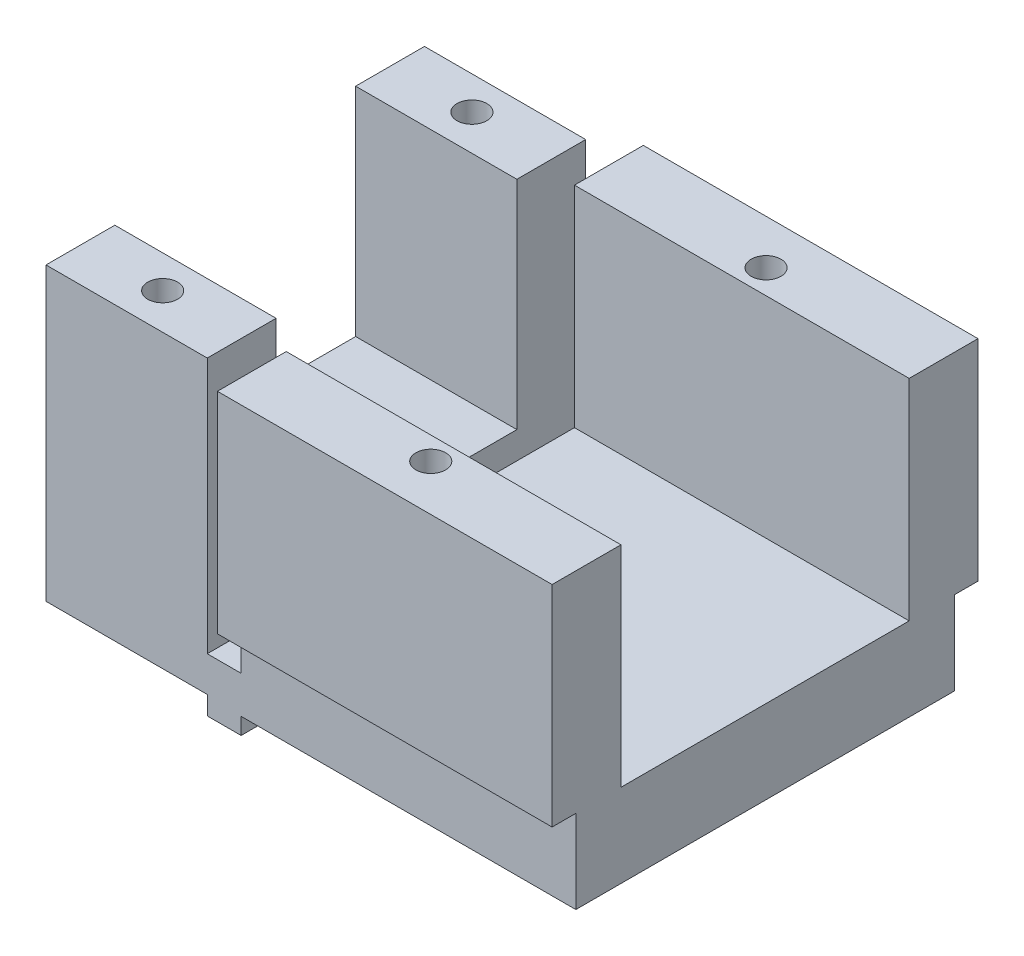
ISO-10303-21;
HEADER;
FILE_DESCRIPTION(('STEP AP214'),'2;1');
FILE_NAME('part.step','',(''),(''),'','','');
FILE_SCHEMA(('AUTOMOTIVE_DESIGN { 1 0 10303 214 1 1 1 1 }'));
ENDSEC;
DATA;
#1=APPLICATION_CONTEXT('core data for automotive mechanical design processes');
#2=APPLICATION_PROTOCOL_DEFINITION('international standard','automotive_design',2000,#1);
#3=PRODUCT_CONTEXT('',#1,'mechanical');
#4=PRODUCT('Part','Part','',(#3));
#5=PRODUCT_RELATED_PRODUCT_CATEGORY('part','',(#4));
#6=PRODUCT_DEFINITION_FORMATION('','',#4);
#7=PRODUCT_DEFINITION_CONTEXT('part definition',#1,'design');
#8=PRODUCT_DEFINITION('design','',#6,#7);
#9=PRODUCT_DEFINITION_SHAPE('','',#8);
#10=(LENGTH_UNIT() NAMED_UNIT(*) SI_UNIT(.MILLI.,.METRE.));
#11=(NAMED_UNIT(*) PLANE_ANGLE_UNIT() SI_UNIT($,.RADIAN.));
#12=(NAMED_UNIT(*) SI_UNIT($,.STERADIAN.) SOLID_ANGLE_UNIT());
#13=UNCERTAINTY_MEASURE_WITH_UNIT(LENGTH_MEASURE(1.E-05),#10,'distance_accuracy_value','');
#14=(GEOMETRIC_REPRESENTATION_CONTEXT(3) GLOBAL_UNCERTAINTY_ASSIGNED_CONTEXT((#13)) GLOBAL_UNIT_ASSIGNED_CONTEXT((#10,
#11,#12)) REPRESENTATION_CONTEXT('',''));
#15=CARTESIAN_POINT('',(0.,0.,0.));
#16=DIRECTION('',(0.,0.,1.));
#17=DIRECTION('',(1.,0.,0.));
#18=AXIS2_PLACEMENT_3D('',#15,#16,#17);
#19=CARTESIAN_POINT('',(11.9,1.27,0.));
#20=DIRECTION('',(-1.,0.,0.));
#21=DIRECTION('',(0.,0.,1.));
#22=AXIS2_PLACEMENT_3D('',#19,#20,#21);
#23=PLANE('',#22);
#24=DIRECTION('',(0.,0.,1.));
#25=VECTOR('',#24,1.);
#26=CARTESIAN_POINT('',(11.9,-1.63,0.));
#27=LINE('',#26,#25);
#28=CARTESIAN_POINT('',(11.9,-1.63,-22.215));
#29=VERTEX_POINT('',#28);
#30=CARTESIAN_POINT('',(11.9,-1.63,5.715));
#31=VERTEX_POINT('',#30);
#32=EDGE_CURVE('E385',#29,#31,#27,.T.);
#33=ORIENTED_EDGE('',*,*,#32,.F.);
#34=DIRECTION('',(0.,-1.,0.));
#35=VECTOR('',#34,1.);
#36=CARTESIAN_POINT('',(11.9,1.27,-22.215));
#37=LINE('',#36,#35);
#38=CARTESIAN_POINT('',(11.9,17.27,-22.215));
#39=VERTEX_POINT('',#38);
#40=EDGE_CURVE('E480',#39,#29,#37,.T.);
#41=ORIENTED_EDGE('',*,*,#40,.F.);
#42=DIRECTION('',(0.,0.,-1.));
#43=VECTOR('',#42,1.);
#44=CARTESIAN_POINT('',(11.9,17.27,-17.135));
#45=LINE('',#44,#43);
#46=CARTESIAN_POINT('',(11.9,17.27,-17.135));
#47=VERTEX_POINT('',#46);
#48=EDGE_CURVE('E377',#47,#39,#45,.T.);
#49=ORIENTED_EDGE('',*,*,#48,.F.);
#50=DIRECTION('',(0.,-1.,0.));
#51=VECTOR('',#50,1.);
#52=CARTESIAN_POINT('',(11.9,16.77,-17.135));
#53=LINE('',#52,#51);
#54=CARTESIAN_POINT('',(11.9,1.27,-17.135));
#55=VERTEX_POINT('',#54);
#56=EDGE_CURVE('E450',#47,#55,#53,.T.);
#57=ORIENTED_EDGE('',*,*,#56,.T.);
#58=DIRECTION('',(0.,0.,-1.));
#59=VECTOR('',#58,1.);
#60=CARTESIAN_POINT('',(11.9,1.27,0.));
#61=LINE('',#60,#59);
#62=CARTESIAN_POINT('',(11.9,1.27,0.635));
#63=VERTEX_POINT('',#62);
#64=EDGE_CURVE('E477',#63,#55,#61,.T.);
#65=ORIENTED_EDGE('',*,*,#64,.F.);
#66=DIRECTION('',(0.,-1.,0.));
#67=VECTOR('',#66,1.);
#68=CARTESIAN_POINT('',(11.9,16.77,0.635));
#69=LINE('',#68,#67);
#70=CARTESIAN_POINT('',(11.9,17.27,0.635));
#71=VERTEX_POINT('',#70);
#72=EDGE_CURVE('E461',#71,#63,#69,.T.);
#73=ORIENTED_EDGE('',*,*,#72,.F.);
#74=DIRECTION('',(0.,0.,-1.));
#75=VECTOR('',#74,1.);
#76=CARTESIAN_POINT('',(11.9,17.27,5.715));
#77=LINE('',#76,#75);
#78=CARTESIAN_POINT('',(11.9,17.27,5.715));
#79=VERTEX_POINT('',#78);
#80=EDGE_CURVE('E349',#79,#71,#77,.T.);
#81=ORIENTED_EDGE('',*,*,#80,.F.);
#82=DIRECTION('',(0.,-1.,0.));
#83=VECTOR('',#82,1.);
#84=CARTESIAN_POINT('',(11.9,1.27,5.715));
#85=LINE('',#84,#83);
#86=EDGE_CURVE('E484',#79,#31,#85,.T.);
#87=ORIENTED_EDGE('',*,*,#86,.T.);
#88=EDGE_LOOP('',(#33,#41,#49,#57,#65,#73,#81,#87));
#89=FACE_BOUND('',#88,.T.);
#90=ADVANCED_FACE('F45',(#89),#23,.F.);
#91=CARTESIAN_POINT('',(0.,1.27,0.));
#92=DIRECTION('',(0.,1.,0.));
#93=DIRECTION('',(0.,0.,1.));
#94=AXIS2_PLACEMENT_3D('',#91,#92,#93);
#95=PLANE('',#94);
#96=ORIENTED_EDGE('',*,*,#64,.T.);
#97=DIRECTION('',(-1.,0.,0.));
#98=VECTOR('',#97,1.);
#99=CARTESIAN_POINT('',(0.,1.27,-17.135));
#100=LINE('',#99,#98);
#101=CARTESIAN_POINT('',(0.,1.27,-17.135));
#102=VERTEX_POINT('',#101);
#103=EDGE_CURVE('E458',#55,#102,#100,.T.);
#104=ORIENTED_EDGE('',*,*,#103,.T.);
#105=DIRECTION('',(0.,0.,-1.));
#106=VECTOR('',#105,1.);
#107=CARTESIAN_POINT('',(0.,1.27,0.));
#108=LINE('',#107,#106);
#109=CARTESIAN_POINT('',(0.,1.27,0.635));
#110=VERTEX_POINT('',#109);
#111=EDGE_CURVE('E473',#110,#102,#108,.T.);
#112=ORIENTED_EDGE('',*,*,#111,.F.);
#113=DIRECTION('',(-1.,0.,0.));
#114=VECTOR('',#113,1.);
#115=CARTESIAN_POINT('',(0.,1.27,0.635));
#116=LINE('',#115,#114);
#117=EDGE_CURVE('E469',#63,#110,#116,.T.);
#118=ORIENTED_EDGE('',*,*,#117,.F.);
#119=EDGE_LOOP('',(#96,#104,#112,#118));
#120=FACE_BOUND('',#119,.T.);
#121=ADVANCED_FACE('F546',(#120),#95,.T.);
#122=CARTESIAN_POINT('',(0.,1.27,-22.215));
#123=DIRECTION('',(0.,0.,-1.));
#124=DIRECTION('',(-1.,0.,0.));
#125=AXIS2_PLACEMENT_3D('',#122,#123,#124);
#126=PLANE('',#125);
#127=ORIENTED_EDGE('',*,*,#40,.T.);
#128=DIRECTION('',(-1.,0.,0.));
#129=VECTOR('',#128,1.);
#130=CARTESIAN_POINT('',(14.4,-1.63,-22.215));
#131=LINE('',#130,#129);
#132=CARTESIAN_POINT('',(14.4,-1.63,-22.215));
#133=VERTEX_POINT('',#132);
#134=EDGE_CURVE('E396',#133,#29,#131,.T.);
#135=ORIENTED_EDGE('',*,*,#134,.F.);
#136=DIRECTION('',(0.,1.,0.));
#137=VECTOR('',#136,1.);
#138=CARTESIAN_POINT('',(14.4,1.27,-22.215));
#139=LINE('',#138,#137);
#140=CARTESIAN_POINT('',(14.4,1.77,-22.215));
#141=VERTEX_POINT('',#140);
#142=EDGE_CURVE('E322',#133,#141,#139,.T.);
#143=ORIENTED_EDGE('',*,*,#142,.T.);
#144=DIRECTION('',(-1.,0.,0.));
#145=VECTOR('',#144,1.);
#146=CARTESIAN_POINT('',(14.4,1.77,-22.215));
#147=LINE('',#146,#145);
#148=CARTESIAN_POINT('',(39.1,1.77,-22.215));
#149=VERTEX_POINT('',#148);
#150=EDGE_CURVE('E313',#149,#141,#147,.T.);
#151=ORIENTED_EDGE('',*,*,#150,.F.);
#152=DIRECTION('',(0.,1.,0.));
#153=VECTOR('',#152,1.);
#154=CARTESIAN_POINT('',(39.1,-3.6175,-22.215));
#155=LINE('',#154,#153);
#156=CARTESIAN_POINT('',(39.1,-4.38,-22.215));
#157=VERTEX_POINT('',#156);
#158=EDGE_CURVE('E325',#157,#149,#155,.T.);
#159=ORIENTED_EDGE('',*,*,#158,.F.);
#160=DIRECTION('',(-1.,0.,0.));
#161=VECTOR('',#160,1.);
#162=CARTESIAN_POINT('',(39.1,-4.38,-22.215));
#163=LINE('',#162,#161);
#164=CARTESIAN_POINT('',(14.4,-4.38,-22.215));
#165=VERTEX_POINT('',#164);
#166=EDGE_CURVE('E328',#157,#165,#163,.T.);
#167=ORIENTED_EDGE('',*,*,#166,.T.);
#168=DIRECTION('',(0.,1.,0.));
#169=VECTOR('',#168,1.);
#170=CARTESIAN_POINT('',(14.4,0.,-22.215));
#171=LINE('',#170,#169);
#172=CARTESIAN_POINT('',(14.4,-5.605,-22.215));
#173=VERTEX_POINT('',#172);
#174=EDGE_CURVE('E404',#173,#165,#171,.T.);
#175=ORIENTED_EDGE('',*,*,#174,.F.);
#176=DIRECTION('',(-1.,0.,0.));
#177=VECTOR('',#176,1.);
#178=CARTESIAN_POINT('',(14.4,-5.605,-22.215));
#179=LINE('',#178,#177);
#180=CARTESIAN_POINT('',(11.9,-5.605,-22.215));
#181=VERTEX_POINT('',#180);
#182=EDGE_CURVE('E424',#173,#181,#179,.T.);
#183=ORIENTED_EDGE('',*,*,#182,.T.);
#184=DIRECTION('',(0.,1.,0.));
#185=VECTOR('',#184,1.);
#186=CARTESIAN_POINT('',(11.9,0.,-22.215));
#187=LINE('',#186,#185);
#188=CARTESIAN_POINT('',(11.9,-4.23,-22.215));
#189=VERTEX_POINT('',#188);
#190=EDGE_CURVE('E415',#181,#189,#187,.T.);
#191=ORIENTED_EDGE('',*,*,#190,.T.);
#192=DIRECTION('',(1.,0.,0.));
#193=VECTOR('',#192,1.);
#194=CARTESIAN_POINT('',(0.,-4.23,-22.215));
#195=LINE('',#194,#193);
#196=CARTESIAN_POINT('',(0.,-4.23,-22.215));
#197=VERTEX_POINT('',#196);
#198=EDGE_CURVE('E433',#197,#189,#195,.T.);
#199=ORIENTED_EDGE('',*,*,#198,.F.);
#200=DIRECTION('',(0.,-1.,0.));
#201=VECTOR('',#200,1.);
#202=CARTESIAN_POINT('',(0.,1.27,-22.215));
#203=LINE('',#202,#201);
#204=CARTESIAN_POINT('',(0.,17.27,-22.215));
#205=VERTEX_POINT('',#204);
#206=EDGE_CURVE('E11',#205,#197,#203,.T.);
#207=ORIENTED_EDGE('',*,*,#206,.F.);
#208=DIRECTION('',(-1.,0.,0.));
#209=VECTOR('',#208,1.);
#210=CARTESIAN_POINT('',(0.,17.27,-22.215));
#211=LINE('',#210,#209);
#212=EDGE_CURVE('E381',#39,#205,#211,.T.);
#213=ORIENTED_EDGE('',*,*,#212,.F.);
#214=EDGE_LOOP('',(#127,#135,#143,#151,#159,#167,#175,#183,#191,#199,#207,#213));
#215=FACE_BOUND('',#214,.T.);
#216=ADVANCED_FACE('F47',(#215),#126,.T.);
#217=CARTESIAN_POINT('',(0.,1.27,0.));
#218=DIRECTION('',(-1.,0.,0.));
#219=DIRECTION('',(0.,0.,1.));
#220=AXIS2_PLACEMENT_3D('',#217,#218,#219);
#221=PLANE('',#220);
#222=ORIENTED_EDGE('',*,*,#206,.T.);
#223=DIRECTION('',(0.,0.,1.));
#224=VECTOR('',#223,1.);
#225=CARTESIAN_POINT('',(0.,-4.23,0.));
#226=LINE('',#225,#224);
#227=CARTESIAN_POINT('',(0.,-4.23,5.715));
#228=VERTEX_POINT('',#227);
#229=EDGE_CURVE('E429',#197,#228,#226,.T.);
#230=ORIENTED_EDGE('',*,*,#229,.T.);
#231=DIRECTION('',(0.,-1.,0.));
#232=VECTOR('',#231,1.);
#233=CARTESIAN_POINT('',(0.,1.27,5.715));
#234=LINE('',#233,#232);
#235=CARTESIAN_POINT('',(0.,17.27,5.715));
#236=VERTEX_POINT('',#235);
#237=EDGE_CURVE('E54',#236,#228,#234,.T.);
#238=ORIENTED_EDGE('',*,*,#237,.F.);
#239=DIRECTION('',(0.,0.,1.));
#240=VECTOR('',#239,1.);
#241=CARTESIAN_POINT('',(0.,17.27,5.715));
#242=LINE('',#241,#240);
#243=CARTESIAN_POINT('',(0.,17.27,0.635));
#244=VERTEX_POINT('',#243);
#245=EDGE_CURVE('E357',#244,#236,#242,.T.);
#246=ORIENTED_EDGE('',*,*,#245,.F.);
#247=DIRECTION('',(0.,-1.,0.));
#248=VECTOR('',#247,1.);
#249=CARTESIAN_POINT('',(0.,16.77,0.635));
#250=LINE('',#249,#248);
#251=EDGE_CURVE('E465',#244,#110,#250,.T.);
#252=ORIENTED_EDGE('',*,*,#251,.T.);
#253=ORIENTED_EDGE('',*,*,#111,.T.);
#254=DIRECTION('',(0.,-1.,0.));
#255=VECTOR('',#254,1.);
#256=CARTESIAN_POINT('',(0.,16.77,-17.135));
#257=LINE('',#256,#255);
#258=CARTESIAN_POINT('',(0.,17.27,-17.135));
#259=VERTEX_POINT('',#258);
#260=EDGE_CURVE('E454',#259,#102,#257,.T.);
#261=ORIENTED_EDGE('',*,*,#260,.F.);
#262=DIRECTION('',(0.,0.,1.));
#263=VECTOR('',#262,1.);
#264=CARTESIAN_POINT('',(0.,17.27,-17.135));
#265=LINE('',#264,#263);
#266=EDGE_CURVE('E369',#205,#259,#265,.T.);
#267=ORIENTED_EDGE('',*,*,#266,.F.);
#268=EDGE_LOOP('',(#222,#230,#238,#246,#252,#253,#261,#267));
#269=FACE_BOUND('',#268,.T.);
#270=ADVANCED_FACE('F495',(#269),#221,.T.);
#271=CARTESIAN_POINT('',(0.,1.27,5.715));
#272=DIRECTION('',(0.,0.,-1.));
#273=DIRECTION('',(-1.,0.,0.));
#274=AXIS2_PLACEMENT_3D('',#271,#272,#273);
#275=PLANE('',#274);
#276=ORIENTED_EDGE('',*,*,#237,.T.);
#277=DIRECTION('',(1.,0.,0.));
#278=VECTOR('',#277,1.);
#279=CARTESIAN_POINT('',(0.,-4.23,5.715));
#280=LINE('',#279,#278);
#281=CARTESIAN_POINT('',(11.9,-4.23,5.715));
#282=VERTEX_POINT('',#281);
#283=EDGE_CURVE('E437',#228,#282,#280,.T.);
#284=ORIENTED_EDGE('',*,*,#283,.T.);
#285=DIRECTION('',(0.,-1.,0.));
#286=VECTOR('',#285,1.);
#287=CARTESIAN_POINT('',(11.9,0.,5.715));
#288=LINE('',#287,#286);
#289=CARTESIAN_POINT('',(11.9,-5.605,5.715));
#290=VERTEX_POINT('',#289);
#291=EDGE_CURVE('E405',#282,#290,#288,.T.);
#292=ORIENTED_EDGE('',*,*,#291,.T.);
#293=DIRECTION('',(-1.,0.,0.));
#294=VECTOR('',#293,1.);
#295=CARTESIAN_POINT('',(14.4,-5.605,5.715));
#296=LINE('',#295,#294);
#297=CARTESIAN_POINT('',(14.4,-5.605,5.715));
#298=VERTEX_POINT('',#297);
#299=EDGE_CURVE('E411',#298,#290,#296,.T.);
#300=ORIENTED_EDGE('',*,*,#299,.F.);
#301=DIRECTION('',(0.,-1.,0.));
#302=VECTOR('',#301,1.);
#303=CARTESIAN_POINT('',(14.4,0.,5.715));
#304=LINE('',#303,#302);
#305=CARTESIAN_POINT('',(14.4,-4.38,5.715));
#306=VERTEX_POINT('',#305);
#307=EDGE_CURVE('E408',#306,#298,#304,.T.);
#308=ORIENTED_EDGE('',*,*,#307,.F.);
#309=DIRECTION('',(-1.,0.,0.));
#310=VECTOR('',#309,1.);
#311=CARTESIAN_POINT('',(39.1,-4.38,5.715));
#312=LINE('',#311,#310);
#313=CARTESIAN_POINT('',(39.1,-4.38,5.715));
#314=VERTEX_POINT('',#313);
#315=EDGE_CURVE('E341',#314,#306,#312,.T.);
#316=ORIENTED_EDGE('',*,*,#315,.F.);
#317=DIRECTION('',(0.,-1.,0.));
#318=VECTOR('',#317,1.);
#319=CARTESIAN_POINT('',(39.1,-1.63,5.715));
#320=LINE('',#319,#318);
#321=CARTESIAN_POINT('',(39.1,1.77,5.715));
#322=VERTEX_POINT('',#321);
#323=EDGE_CURVE('E318',#322,#314,#320,.T.);
#324=ORIENTED_EDGE('',*,*,#323,.F.);
#325=DIRECTION('',(1.,0.,0.));
#326=VECTOR('',#325,1.);
#327=CARTESIAN_POINT('',(14.4,1.77,5.715));
#328=LINE('',#327,#326);
#329=CARTESIAN_POINT('',(14.4,1.77,5.715));
#330=VERTEX_POINT('',#329);
#331=EDGE_CURVE('E307',#330,#322,#328,.T.);
#332=ORIENTED_EDGE('',*,*,#331,.F.);
#333=DIRECTION('',(0.,-1.,0.));
#334=VECTOR('',#333,1.);
#335=CARTESIAN_POINT('',(14.4,-1.63,5.715));
#336=LINE('',#335,#334);
#337=CARTESIAN_POINT('',(14.4,-1.63,5.715));
#338=VERTEX_POINT('',#337);
#339=EDGE_CURVE('E317',#330,#338,#336,.T.);
#340=ORIENTED_EDGE('',*,*,#339,.T.);
#341=DIRECTION('',(-1.,0.,0.));
#342=VECTOR('',#341,1.);
#343=CARTESIAN_POINT('',(14.4,-1.63,5.715));
#344=LINE('',#343,#342);
#345=EDGE_CURVE('E390',#338,#31,#344,.T.);
#346=ORIENTED_EDGE('',*,*,#345,.T.);
#347=ORIENTED_EDGE('',*,*,#86,.F.);
#348=DIRECTION('',(1.,0.,0.));
#349=VECTOR('',#348,1.);
#350=CARTESIAN_POINT('',(0.,17.27,5.715));
#351=LINE('',#350,#349);
#352=EDGE_CURVE('E353',#236,#79,#351,.T.);
#353=ORIENTED_EDGE('',*,*,#352,.F.);
#354=EDGE_LOOP('',(#276,#284,#292,#300,#308,#316,#324,#332,#340,#346,#347,#353));
#355=FACE_BOUND('',#354,.T.);
#356=ADVANCED_FACE('F490',(#355),#275,.F.);
#357=CARTESIAN_POINT('',(0.,16.77,0.635));
#358=DIRECTION('',(0.,0.,-1.));
#359=DIRECTION('',(-1.,0.,0.));
#360=AXIS2_PLACEMENT_3D('',#357,#358,#359);
#361=PLANE('',#360);
#362=ORIENTED_EDGE('',*,*,#72,.T.);
#363=ORIENTED_EDGE('',*,*,#117,.T.);
#364=ORIENTED_EDGE('',*,*,#251,.F.);
#365=DIRECTION('',(-1.,0.,0.));
#366=VECTOR('',#365,1.);
#367=CARTESIAN_POINT('',(0.,17.27,0.635));
#368=LINE('',#367,#366);
#369=EDGE_CURVE('E345',#71,#244,#368,.T.);
#370=ORIENTED_EDGE('',*,*,#369,.F.);
#371=EDGE_LOOP('',(#362,#363,#364,#370));
#372=FACE_BOUND('',#371,.T.);
#373=ADVANCED_FACE('F558',(#372),#361,.T.);
#374=CARTESIAN_POINT('',(0.,16.77,-17.135));
#375=DIRECTION('',(0.,0.,-1.));
#376=DIRECTION('',(-1.,0.,0.));
#377=AXIS2_PLACEMENT_3D('',#374,#375,#376);
#378=PLANE('',#377);
#379=ORIENTED_EDGE('',*,*,#103,.F.);
#380=ORIENTED_EDGE('',*,*,#56,.F.);
#381=DIRECTION('',(1.,0.,0.));
#382=VECTOR('',#381,1.);
#383=CARTESIAN_POINT('',(0.,17.27,-17.135));
#384=LINE('',#383,#382);
#385=EDGE_CURVE('E373',#259,#47,#384,.T.);
#386=ORIENTED_EDGE('',*,*,#385,.F.);
#387=ORIENTED_EDGE('',*,*,#260,.T.);
#388=EDGE_LOOP('',(#379,#380,#386,#387));
#389=FACE_BOUND('',#388,.T.);
#390=ADVANCED_FACE('F575',(#389),#378,.F.);
#391=CARTESIAN_POINT('',(0.,-4.23,0.));
#392=DIRECTION('',(0.,1.,0.));
#393=DIRECTION('',(0.,0.,1.));
#394=AXIS2_PLACEMENT_3D('',#391,#392,#393);
#395=PLANE('',#394);
#396=DIRECTION('',(0.,0.,1.));
#397=VECTOR('',#396,1.);
#398=CARTESIAN_POINT('',(11.9,-4.23,0.));
#399=LINE('',#398,#397);
#400=EDGE_CURVE('E428',#189,#282,#399,.T.);
#401=ORIENTED_EDGE('',*,*,#400,.T.);
#402=ORIENTED_EDGE('',*,*,#283,.F.);
#403=ORIENTED_EDGE('',*,*,#229,.F.);
#404=ORIENTED_EDGE('',*,*,#198,.T.);
#405=EDGE_LOOP('',(#401,#402,#403,#404));
#406=FACE_BOUND('',#405,.T.);
#407=ADVANCED_FACE('F499',(#406),#395,.F.);
#408=CARTESIAN_POINT('',(14.4,-5.605,0.));
#409=DIRECTION('',(0.,1.,0.));
#410=DIRECTION('',(0.,0.,1.));
#411=AXIS2_PLACEMENT_3D('',#408,#409,#410);
#412=PLANE('',#411);
#413=DIRECTION('',(0.,0.,-1.));
#414=VECTOR('',#413,1.);
#415=CARTESIAN_POINT('',(11.9,-5.605,0.));
#416=LINE('',#415,#414);
#417=EDGE_CURVE('E399',#290,#181,#416,.T.);
#418=ORIENTED_EDGE('',*,*,#417,.T.);
#419=ORIENTED_EDGE('',*,*,#182,.F.);
#420=DIRECTION('',(0.,0.,-1.));
#421=VECTOR('',#420,1.);
#422=CARTESIAN_POINT('',(14.4,-5.605,0.));
#423=LINE('',#422,#421);
#424=EDGE_CURVE('E400',#298,#173,#423,.T.);
#425=ORIENTED_EDGE('',*,*,#424,.F.);
#426=ORIENTED_EDGE('',*,*,#299,.T.);
#427=EDGE_LOOP('',(#418,#419,#425,#426));
#428=FACE_BOUND('',#427,.T.);
#429=ADVANCED_FACE('F509',(#428),#412,.F.);
#430=CARTESIAN_POINT('',(14.4,0.,0.));
#431=DIRECTION('',(1.,0.,0.));
#432=DIRECTION('',(0.,0.,-1.));
#433=AXIS2_PLACEMENT_3D('',#430,#431,#432);
#434=PLANE('',#433);
#435=DIRECTION('',(0.,0.,-1.));
#436=VECTOR('',#435,1.);
#437=CARTESIAN_POINT('',(14.4,-4.38,-22.215));
#438=LINE('',#437,#436);
#439=EDGE_CURVE('E332',#306,#165,#438,.T.);
#440=ORIENTED_EDGE('',*,*,#439,.F.);
#441=ORIENTED_EDGE('',*,*,#307,.T.);
#442=ORIENTED_EDGE('',*,*,#424,.T.);
#443=ORIENTED_EDGE('',*,*,#174,.T.);
#444=EDGE_LOOP('',(#440,#441,#442,#443));
#445=FACE_BOUND('',#444,.T.);
#446=ADVANCED_FACE('F512',(#445),#434,.T.);
#447=CARTESIAN_POINT('',(11.9,0.,0.));
#448=DIRECTION('',(1.,0.,0.));
#449=DIRECTION('',(0.,0.,-1.));
#450=AXIS2_PLACEMENT_3D('',#447,#448,#449);
#451=PLANE('',#450);
#452=ORIENTED_EDGE('',*,*,#400,.F.);
#453=ORIENTED_EDGE('',*,*,#190,.F.);
#454=ORIENTED_EDGE('',*,*,#417,.F.);
#455=ORIENTED_EDGE('',*,*,#291,.F.);
#456=EDGE_LOOP('',(#452,#453,#454,#455));
#457=FACE_BOUND('',#456,.T.);
#458=ADVANCED_FACE('F504',(#457),#451,.F.);
#459=CARTESIAN_POINT('',(14.4,-1.63,0.));
#460=DIRECTION('',(0.,-1.,0.));
#461=DIRECTION('',(0.,0.,-1.));
#462=AXIS2_PLACEMENT_3D('',#459,#460,#461);
#463=PLANE('',#462);
#464=ORIENTED_EDGE('',*,*,#32,.T.);
#465=ORIENTED_EDGE('',*,*,#345,.F.);
#466=DIRECTION('',(0.,0.,1.));
#467=VECTOR('',#466,1.);
#468=CARTESIAN_POINT('',(14.4,-1.63,0.));
#469=LINE('',#468,#467);
#470=EDGE_CURVE('E386',#133,#338,#469,.T.);
#471=ORIENTED_EDGE('',*,*,#470,.F.);
#472=ORIENTED_EDGE('',*,*,#134,.T.);
#473=EDGE_LOOP('',(#464,#465,#471,#472));
#474=FACE_BOUND('',#473,.T.);
#475=ADVANCED_FACE('F584',(#474),#463,.F.);
#476=CARTESIAN_POINT('',(0.,17.27,0.));
#477=DIRECTION('',(0.,-1.,0.));
#478=DIRECTION('',(0.,0.,-1.));
#479=AXIS2_PLACEMENT_3D('',#476,#477,#478);
#480=PLANE('',#479);
#481=ORIENTED_EDGE('',*,*,#266,.T.);
#482=ORIENTED_EDGE('',*,*,#385,.T.);
#483=ORIENTED_EDGE('',*,*,#48,.T.);
#484=ORIENTED_EDGE('',*,*,#212,.T.);
#485=EDGE_LOOP('',(#481,#482,#483,#484));
#486=FACE_BOUND('',#485,.T.);
#487=CARTESIAN_POINT('',(5.95,17.27,-19.765430594767));
#488=DIRECTION('',(0.,1.,0.));
#489=DIRECTION('',(0.,0.,1.));
#490=AXIS2_PLACEMENT_3D('',#487,#488,#489);
#491=CIRCLE('',#490,1.1);
#492=CARTESIAN_POINT('',(5.95,17.27,-18.665430594767));
#493=VERTEX_POINT('',#492);
#494=EDGE_CURVE('E365',#493,#493,#491,.T.);
#495=ORIENTED_EDGE('',*,*,#494,.F.);
#496=EDGE_LOOP('',(#495));
#497=FACE_BOUND('',#496,.T.);
#498=ADVANCED_FACE('F570',(#486,#497),#480,.F.);
#499=CARTESIAN_POINT('',(5.95,6.61,-19.765430594767));
#500=DIRECTION('',(0.,1.,0.));
#501=DIRECTION('',(0.,0.,1.));
#502=AXIS2_PLACEMENT_3D('',#499,#500,#501);
#503=PLANE('',#502);
#504=CARTESIAN_POINT('',(5.95,6.61,-19.765430594767));
#505=DIRECTION('',(0.,1.,0.));
#506=DIRECTION('',(0.,0.,1.));
#507=AXIS2_PLACEMENT_3D('',#504,#505,#506);
#508=CIRCLE('',#507,1.1);
#509=CARTESIAN_POINT('',(5.95,6.61,-18.665430594767));
#510=VERTEX_POINT('',#509);
#511=EDGE_CURVE('E446',#510,#510,#508,.T.);
#512=ORIENTED_EDGE('',*,*,#511,.T.);
#513=EDGE_LOOP('',(#512));
#514=FACE_BOUND('',#513,.T.);
#515=ADVANCED_FACE('F805',(#514),#503,.T.);
#516=CARTESIAN_POINT('',(5.95,6.61,-19.765430594767));
#517=DIRECTION('',(0.,1.,0.));
#518=DIRECTION('',(0.,0.,1.));
#519=AXIS2_PLACEMENT_3D('',#516,#517,#518);
#520=CYLINDRICAL_SURFACE('',#519,1.1);
#521=ORIENTED_EDGE('',*,*,#511,.F.);
#522=EDGE_LOOP('',(#521));
#523=FACE_BOUND('',#522,.T.);
#524=ORIENTED_EDGE('',*,*,#494,.T.);
#525=EDGE_LOOP('',(#524));
#526=FACE_BOUND('',#525,.T.);
#527=ADVANCED_FACE('F795',(#523,#526),#520,.F.);
#528=CARTESIAN_POINT('',(0.,17.27,0.));
#529=DIRECTION('',(0.,-1.,0.));
#530=DIRECTION('',(0.,0.,-1.));
#531=AXIS2_PLACEMENT_3D('',#528,#529,#530);
#532=PLANE('',#531);
#533=ORIENTED_EDGE('',*,*,#245,.T.);
#534=ORIENTED_EDGE('',*,*,#352,.T.);
#535=ORIENTED_EDGE('',*,*,#80,.T.);
#536=ORIENTED_EDGE('',*,*,#369,.T.);
#537=EDGE_LOOP('',(#533,#534,#535,#536));
#538=FACE_BOUND('',#537,.T.);
#539=CARTESIAN_POINT('',(5.95,17.27,3.0563306877283));
#540=DIRECTION('',(0.,1.,0.));
#541=DIRECTION('',(0.,0.,1.));
#542=AXIS2_PLACEMENT_3D('',#539,#540,#541);
#543=CIRCLE('',#542,1.09999999999999);
#544=CARTESIAN_POINT('',(5.95,17.27,4.15633068772829));
#545=VERTEX_POINT('',#544);
#546=EDGE_CURVE('E361',#545,#545,#543,.T.);
#547=ORIENTED_EDGE('',*,*,#546,.F.);
#548=EDGE_LOOP('',(#547));
#549=FACE_BOUND('',#548,.T.);
#550=ADVANCED_FACE('F581',(#538,#549),#532,.F.);
#551=CARTESIAN_POINT('',(5.95,6.61,3.05633068772832));
#552=DIRECTION('',(0.,1.,0.));
#553=DIRECTION('',(0.,0.,1.));
#554=AXIS2_PLACEMENT_3D('',#551,#552,#553);
#555=PLANE('',#554);
#556=CARTESIAN_POINT('',(5.95,6.61,3.05633068772832));
#557=DIRECTION('',(0.,1.,0.));
#558=DIRECTION('',(0.,0.,1.));
#559=AXIS2_PLACEMENT_3D('',#556,#557,#558);
#560=CIRCLE('',#559,1.1);
#561=CARTESIAN_POINT('',(5.95,6.61,4.15633068772831));
#562=VERTEX_POINT('',#561);
#563=EDGE_CURVE('E440',#562,#562,#560,.T.);
#564=ORIENTED_EDGE('',*,*,#563,.T.);
#565=EDGE_LOOP('',(#564));
#566=FACE_BOUND('',#565,.T.);
#567=ADVANCED_FACE('F782',(#566),#555,.T.);
#568=CARTESIAN_POINT('',(5.95,6.61,3.05633068772832));
#569=DIRECTION('',(0.,1.,0.));
#570=DIRECTION('',(0.,0.,1.));
#571=AXIS2_PLACEMENT_3D('',#568,#569,#570);
#572=CYLINDRICAL_SURFACE('',#571,1.1);
#573=ORIENTED_EDGE('',*,*,#563,.F.);
#574=EDGE_LOOP('',(#573));
#575=FACE_BOUND('',#574,.T.);
#576=ORIENTED_EDGE('',*,*,#546,.T.);
#577=EDGE_LOOP('',(#576));
#578=FACE_BOUND('',#577,.T.);
#579=ADVANCED_FACE('F748',(#575,#578),#572,.F.);
#580=CARTESIAN_POINT('',(39.1,-4.38,-22.215));
#581=DIRECTION('',(0.,1.,0.));
#582=DIRECTION('',(0.,0.,1.));
#583=AXIS2_PLACEMENT_3D('',#580,#581,#582);
#584=PLANE('',#583);
#585=ORIENTED_EDGE('',*,*,#439,.T.);
#586=ORIENTED_EDGE('',*,*,#166,.F.);
#587=DIRECTION('',(0.,0.,-1.));
#588=VECTOR('',#587,1.);
#589=CARTESIAN_POINT('',(39.1,-4.38,-22.215));
#590=LINE('',#589,#588);
#591=EDGE_CURVE('E321',#314,#157,#590,.T.);
#592=ORIENTED_EDGE('',*,*,#591,.F.);
#593=ORIENTED_EDGE('',*,*,#315,.T.);
#594=EDGE_LOOP('',(#585,#586,#592,#593));
#595=FACE_BOUND('',#594,.T.);
#596=ADVANCED_FACE('F516',(#595),#584,.F.);
#597=CARTESIAN_POINT('',(39.1,0.,0.));
#598=DIRECTION('',(-1.,0.,0.));
#599=DIRECTION('',(0.,0.,1.));
#600=AXIS2_PLACEMENT_3D('',#597,#598,#599);
#601=PLANE('',#600);
#602=ORIENTED_EDGE('',*,*,#323,.T.);
#603=ORIENTED_EDGE('',*,*,#591,.T.);
#604=ORIENTED_EDGE('',*,*,#158,.T.);
#605=DIRECTION('',(0.,0.,-1.));
#606=VECTOR('',#605,1.);
#607=CARTESIAN_POINT('',(39.1,1.77,0.));
#608=LINE('',#607,#606);
#609=CARTESIAN_POINT('',(39.1,1.77,-23.965));
#610=VERTEX_POINT('',#609);
#611=EDGE_CURVE('E282',#149,#610,#608,.T.);
#612=ORIENTED_EDGE('',*,*,#611,.T.);
#613=DIRECTION('',(0.,-1.,0.));
#614=VECTOR('',#613,1.);
#615=CARTESIAN_POINT('',(39.1,17.27,-23.965));
#616=LINE('',#615,#614);
#617=CARTESIAN_POINT('',(39.1,17.27,-23.965));
#618=VERTEX_POINT('',#617);
#619=EDGE_CURVE('E298',#618,#610,#616,.T.);
#620=ORIENTED_EDGE('',*,*,#619,.F.);
#621=DIRECTION('',(0.,0.,-1.));
#622=VECTOR('',#621,1.);
#623=CARTESIAN_POINT('',(39.1,17.27,0.));
#624=LINE('',#623,#622);
#625=CARTESIAN_POINT('',(39.1,17.27,-18.885));
#626=VERTEX_POINT('',#625);
#627=EDGE_CURVE('E268',#626,#618,#624,.T.);
#628=ORIENTED_EDGE('',*,*,#627,.F.);
#629=DIRECTION('',(0.,-1.,0.));
#630=VECTOR('',#629,1.);
#631=CARTESIAN_POINT('',(39.1,17.27,-18.885));
#632=LINE('',#631,#630);
#633=CARTESIAN_POINT('',(39.1,1.77,-18.885));
#634=VERTEX_POINT('',#633);
#635=EDGE_CURVE('E302',#626,#634,#632,.T.);
#636=ORIENTED_EDGE('',*,*,#635,.T.);
#637=DIRECTION('',(0.,0.,-1.));
#638=VECTOR('',#637,1.);
#639=CARTESIAN_POINT('',(39.1,1.77,5.715));
#640=LINE('',#639,#638);
#641=CARTESIAN_POINT('',(39.1,1.77,2.385));
#642=VERTEX_POINT('',#641);
#643=EDGE_CURVE('E66',#642,#634,#640,.T.);
#644=ORIENTED_EDGE('',*,*,#643,.F.);
#645=DIRECTION('',(0.,-1.,0.));
#646=VECTOR('',#645,1.);
#647=CARTESIAN_POINT('',(39.1,17.27,2.385));
#648=LINE('',#647,#646);
#649=CARTESIAN_POINT('',(39.1,17.27,2.385));
#650=VERTEX_POINT('',#649);
#651=EDGE_CURVE('E247',#650,#642,#648,.T.);
#652=ORIENTED_EDGE('',*,*,#651,.F.);
#653=DIRECTION('',(0.,0.,-1.));
#654=VECTOR('',#653,1.);
#655=CARTESIAN_POINT('',(39.1,17.27,0.));
#656=LINE('',#655,#654);
#657=CARTESIAN_POINT('',(39.1,17.27,7.465));
#658=VERTEX_POINT('',#657);
#659=EDGE_CURVE('E230',#658,#650,#656,.T.);
#660=ORIENTED_EDGE('',*,*,#659,.F.);
#661=DIRECTION('',(0.,-1.,0.));
#662=VECTOR('',#661,1.);
#663=CARTESIAN_POINT('',(39.1,17.27,7.465));
#664=LINE('',#663,#662);
#665=CARTESIAN_POINT('',(39.1,1.77,7.465));
#666=VERTEX_POINT('',#665);
#667=EDGE_CURVE('E259',#658,#666,#664,.T.);
#668=ORIENTED_EDGE('',*,*,#667,.T.);
#669=DIRECTION('',(0.,0.,-1.));
#670=VECTOR('',#669,1.);
#671=CARTESIAN_POINT('',(39.1,1.77,0.));
#672=LINE('',#671,#670);
#673=EDGE_CURVE('E233',#666,#322,#672,.T.);
#674=ORIENTED_EDGE('',*,*,#673,.T.);
#675=EDGE_LOOP('',(#602,#603,#604,#612,#620,#628,#636,#644,#652,#660,#668,#674));
#676=FACE_BOUND('',#675,.T.);
#677=ADVANCED_FACE('F520',(#676),#601,.F.);
#678=CARTESIAN_POINT('',(14.4,0.,0.));
#679=DIRECTION('',(-1.,0.,0.));
#680=DIRECTION('',(0.,0.,1.));
#681=AXIS2_PLACEMENT_3D('',#678,#679,#680);
#682=PLANE('',#681);
#683=ORIENTED_EDGE('',*,*,#142,.F.);
#684=ORIENTED_EDGE('',*,*,#470,.T.);
#685=ORIENTED_EDGE('',*,*,#339,.F.);
#686=DIRECTION('',(0.,0.,1.));
#687=VECTOR('',#686,1.);
#688=CARTESIAN_POINT('',(14.4,1.77,0.));
#689=LINE('',#688,#687);
#690=CARTESIAN_POINT('',(14.4,1.77,7.465));
#691=VERTEX_POINT('',#690);
#692=EDGE_CURVE('E250',#330,#691,#689,.T.);
#693=ORIENTED_EDGE('',*,*,#692,.T.);
#694=DIRECTION('',(0.,-1.,0.));
#695=VECTOR('',#694,1.);
#696=CARTESIAN_POINT('',(14.4,17.27,7.465));
#697=LINE('',#696,#695);
#698=CARTESIAN_POINT('',(14.4,17.27,7.465));
#699=VERTEX_POINT('',#698);
#700=EDGE_CURVE('E215',#699,#691,#697,.T.);
#701=ORIENTED_EDGE('',*,*,#700,.F.);
#702=DIRECTION('',(0.,0.,1.));
#703=VECTOR('',#702,1.);
#704=CARTESIAN_POINT('',(14.4,17.27,0.));
#705=LINE('',#704,#703);
#706=CARTESIAN_POINT('',(14.4,17.27,2.385));
#707=VERTEX_POINT('',#706);
#708=EDGE_CURVE('E218',#707,#699,#705,.T.);
#709=ORIENTED_EDGE('',*,*,#708,.F.);
#710=DIRECTION('',(0.,-1.,0.));
#711=VECTOR('',#710,1.);
#712=CARTESIAN_POINT('',(14.4,17.27,2.385));
#713=LINE('',#712,#711);
#714=CARTESIAN_POINT('',(14.4,1.77,2.385));
#715=VERTEX_POINT('',#714);
#716=EDGE_CURVE('E205',#707,#715,#713,.T.);
#717=ORIENTED_EDGE('',*,*,#716,.T.);
#718=DIRECTION('',(0.,0.,1.));
#719=VECTOR('',#718,1.);
#720=CARTESIAN_POINT('',(14.4,1.77,5.715));
#721=LINE('',#720,#719);
#722=CARTESIAN_POINT('',(14.4,1.77,-18.885));
#723=VERTEX_POINT('',#722);
#724=EDGE_CURVE('E61',#723,#715,#721,.T.);
#725=ORIENTED_EDGE('',*,*,#724,.F.);
#726=DIRECTION('',(0.,-1.,0.));
#727=VECTOR('',#726,1.);
#728=CARTESIAN_POINT('',(14.4,17.27,-18.885));
#729=LINE('',#728,#727);
#730=CARTESIAN_POINT('',(14.4,17.27,-18.885));
#731=VERTEX_POINT('',#730);
#732=EDGE_CURVE('E279',#731,#723,#729,.T.);
#733=ORIENTED_EDGE('',*,*,#732,.F.);
#734=DIRECTION('',(0.,0.,1.));
#735=VECTOR('',#734,1.);
#736=CARTESIAN_POINT('',(14.4,17.27,0.));
#737=LINE('',#736,#735);
#738=CARTESIAN_POINT('',(14.4,17.27,-23.965));
#739=VERTEX_POINT('',#738);
#740=EDGE_CURVE('E276',#739,#731,#737,.T.);
#741=ORIENTED_EDGE('',*,*,#740,.F.);
#742=DIRECTION('',(0.,-1.,0.));
#743=VECTOR('',#742,1.);
#744=CARTESIAN_POINT('',(14.4,17.27,-23.965));
#745=LINE('',#744,#743);
#746=CARTESIAN_POINT('',(14.4,1.77,-23.965));
#747=VERTEX_POINT('',#746);
#748=EDGE_CURVE('E295',#739,#747,#745,.T.);
#749=ORIENTED_EDGE('',*,*,#748,.T.);
#750=DIRECTION('',(0.,0.,1.));
#751=VECTOR('',#750,1.);
#752=CARTESIAN_POINT('',(14.4,1.77,0.));
#753=LINE('',#752,#751);
#754=EDGE_CURVE('E269',#747,#141,#753,.T.);
#755=ORIENTED_EDGE('',*,*,#754,.T.);
#756=EDGE_LOOP('',(#683,#684,#685,#693,#701,#709,#717,#725,#733,#741,#749,#755));
#757=FACE_BOUND('',#756,.T.);
#758=ADVANCED_FACE('F220',(#757),#682,.T.);
#759=CARTESIAN_POINT('',(0.,1.77,0.));
#760=DIRECTION('',(0.,-1.,0.));
#761=DIRECTION('',(0.,0.,-1.));
#762=AXIS2_PLACEMENT_3D('',#759,#760,#761);
#763=PLANE('',#762);
#764=ORIENTED_EDGE('',*,*,#724,.T.);
#765=DIRECTION('',(1.,0.,0.));
#766=VECTOR('',#765,1.);
#767=CARTESIAN_POINT('',(0.,1.77,2.385));
#768=LINE('',#767,#766);
#769=EDGE_CURVE('E211',#715,#642,#768,.T.);
#770=ORIENTED_EDGE('',*,*,#769,.T.);
#771=ORIENTED_EDGE('',*,*,#643,.T.);
#772=DIRECTION('',(-1.,0.,0.));
#773=VECTOR('',#772,1.);
#774=CARTESIAN_POINT('',(0.,1.77,-18.885));
#775=LINE('',#774,#773);
#776=EDGE_CURVE('E214',#634,#723,#775,.T.);
#777=ORIENTED_EDGE('',*,*,#776,.T.);
#778=EDGE_LOOP('',(#764,#770,#771,#777));
#779=FACE_BOUND('',#778,.T.);
#780=ADVANCED_FACE('F532',(#779),#763,.F.);
#781=CARTESIAN_POINT('',(0.,17.27,-18.885));
#782=DIRECTION('',(0.,0.,1.));
#783=DIRECTION('',(1.,0.,0.));
#784=AXIS2_PLACEMENT_3D('',#781,#782,#783);
#785=PLANE('',#784);
#786=ORIENTED_EDGE('',*,*,#776,.F.);
#787=ORIENTED_EDGE('',*,*,#635,.F.);
#788=DIRECTION('',(-1.,0.,0.));
#789=VECTOR('',#788,1.);
#790=CARTESIAN_POINT('',(0.,17.27,-18.885));
#791=LINE('',#790,#789);
#792=EDGE_CURVE('E264',#626,#731,#791,.T.);
#793=ORIENTED_EDGE('',*,*,#792,.T.);
#794=ORIENTED_EDGE('',*,*,#732,.T.);
#795=EDGE_LOOP('',(#786,#787,#793,#794));
#796=FACE_BOUND('',#795,.T.);
#797=ADVANCED_FACE('F534',(#796),#785,.T.);
#798=CARTESIAN_POINT('',(0.,17.27,-23.965));
#799=DIRECTION('',(0.,0.,-1.));
#800=DIRECTION('',(-1.,0.,0.));
#801=AXIS2_PLACEMENT_3D('',#798,#799,#800);
#802=PLANE('',#801);
#803=DIRECTION('',(1.,0.,0.));
#804=VECTOR('',#803,1.);
#805=CARTESIAN_POINT('',(0.,1.77,-23.965));
#806=LINE('',#805,#804);
#807=EDGE_CURVE('E285',#747,#610,#806,.T.);
#808=ORIENTED_EDGE('',*,*,#807,.F.);
#809=ORIENTED_EDGE('',*,*,#748,.F.);
#810=DIRECTION('',(1.,0.,0.));
#811=VECTOR('',#810,1.);
#812=CARTESIAN_POINT('',(0.,17.27,-23.965));
#813=LINE('',#812,#811);
#814=EDGE_CURVE('E272',#739,#618,#813,.T.);
#815=ORIENTED_EDGE('',*,*,#814,.T.);
#816=ORIENTED_EDGE('',*,*,#619,.T.);
#817=EDGE_LOOP('',(#808,#809,#815,#816));
#818=FACE_BOUND('',#817,.T.);
#819=ADVANCED_FACE('F540',(#818),#802,.T.);
#820=CARTESIAN_POINT('',(0.,17.27,0.));
#821=DIRECTION('',(0.,1.,0.));
#822=DIRECTION('',(0.,0.,1.));
#823=AXIS2_PLACEMENT_3D('',#820,#821,#822);
#824=PLANE('',#823);
#825=CARTESIAN_POINT('',(26.75,17.27,-20.675));
#826=DIRECTION('',(0.,1.,0.));
#827=DIRECTION('',(0.,0.,1.));
#828=AXIS2_PLACEMENT_3D('',#825,#826,#827);
#829=CIRCLE('',#828,1.1);
#830=CARTESIAN_POINT('',(26.75,17.27,-19.575));
#831=VERTEX_POINT('',#830);
#832=EDGE_CURVE('E638',#831,#831,#829,.T.);
#833=ORIENTED_EDGE('',*,*,#832,.F.);
#834=EDGE_LOOP('',(#833));
#835=FACE_BOUND('',#834,.T.);
#836=ORIENTED_EDGE('',*,*,#792,.F.);
#837=ORIENTED_EDGE('',*,*,#627,.T.);
#838=ORIENTED_EDGE('',*,*,#814,.F.);
#839=ORIENTED_EDGE('',*,*,#740,.T.);
#840=EDGE_LOOP('',(#836,#837,#838,#839));
#841=FACE_BOUND('',#840,.T.);
#842=ADVANCED_FACE('F596',(#835,#841),#824,.T.);
#843=CARTESIAN_POINT('',(0.,1.77,0.));
#844=DIRECTION('',(0.,1.,0.));
#845=DIRECTION('',(0.,0.,1.));
#846=AXIS2_PLACEMENT_3D('',#843,#844,#845);
#847=PLANE('',#846);
#848=ORIENTED_EDGE('',*,*,#150,.T.);
#849=ORIENTED_EDGE('',*,*,#754,.F.);
#850=ORIENTED_EDGE('',*,*,#807,.T.);
#851=ORIENTED_EDGE('',*,*,#611,.F.);
#852=EDGE_LOOP('',(#848,#849,#850,#851));
#853=FACE_BOUND('',#852,.T.);
#854=ADVANCED_FACE('F588',(#853),#847,.F.);
#855=CARTESIAN_POINT('',(0.,1.77,0.));
#856=DIRECTION('',(0.,1.,0.));
#857=DIRECTION('',(0.,0.,1.));
#858=AXIS2_PLACEMENT_3D('',#855,#856,#857);
#859=PLANE('',#858);
#860=ORIENTED_EDGE('',*,*,#692,.F.);
#861=ORIENTED_EDGE('',*,*,#331,.T.);
#862=ORIENTED_EDGE('',*,*,#673,.F.);
#863=DIRECTION('',(-1.,0.,0.));
#864=VECTOR('',#863,1.);
#865=CARTESIAN_POINT('',(0.,1.77,7.465));
#866=LINE('',#865,#864);
#867=EDGE_CURVE('E237',#666,#691,#866,.T.);
#868=ORIENTED_EDGE('',*,*,#867,.T.);
#869=EDGE_LOOP('',(#860,#861,#862,#868));
#870=FACE_BOUND('',#869,.T.);
#871=ADVANCED_FACE('F526',(#870),#859,.F.);
#872=CARTESIAN_POINT('',(0.,17.27,2.385));
#873=DIRECTION('',(0.,0.,-1.));
#874=DIRECTION('',(-1.,0.,0.));
#875=AXIS2_PLACEMENT_3D('',#872,#873,#874);
#876=PLANE('',#875);
#877=ORIENTED_EDGE('',*,*,#769,.F.);
#878=ORIENTED_EDGE('',*,*,#716,.F.);
#879=DIRECTION('',(1.,0.,0.));
#880=VECTOR('',#879,1.);
#881=CARTESIAN_POINT('',(0.,17.27,2.385));
#882=LINE('',#881,#880);
#883=EDGE_CURVE('E210',#707,#650,#882,.T.);
#884=ORIENTED_EDGE('',*,*,#883,.T.);
#885=ORIENTED_EDGE('',*,*,#651,.T.);
#886=EDGE_LOOP('',(#877,#878,#884,#885));
#887=FACE_BOUND('',#886,.T.);
#888=ADVANCED_FACE('F207',(#887),#876,.T.);
#889=CARTESIAN_POINT('',(0.,17.27,7.465));
#890=DIRECTION('',(0.,0.,1.));
#891=DIRECTION('',(1.,0.,0.));
#892=AXIS2_PLACEMENT_3D('',#889,#890,#891);
#893=PLANE('',#892);
#894=ORIENTED_EDGE('',*,*,#867,.F.);
#895=ORIENTED_EDGE('',*,*,#667,.F.);
#896=DIRECTION('',(-1.,0.,0.));
#897=VECTOR('',#896,1.);
#898=CARTESIAN_POINT('',(0.,17.27,7.465));
#899=LINE('',#898,#897);
#900=EDGE_CURVE('E226',#658,#699,#899,.T.);
#901=ORIENTED_EDGE('',*,*,#900,.T.);
#902=ORIENTED_EDGE('',*,*,#700,.T.);
#903=EDGE_LOOP('',(#894,#895,#901,#902));
#904=FACE_BOUND('',#903,.T.);
#905=ADVANCED_FACE('F529',(#904),#893,.T.);
#906=CARTESIAN_POINT('',(0.,17.27,0.));
#907=DIRECTION('',(0.,1.,0.));
#908=DIRECTION('',(0.,0.,1.));
#909=AXIS2_PLACEMENT_3D('',#906,#907,#908);
#910=PLANE('',#909);
#911=CARTESIAN_POINT('',(26.75,17.27,4.06978770225787));
#912=DIRECTION('',(0.,1.,0.));
#913=DIRECTION('',(0.,0.,1.));
#914=AXIS2_PLACEMENT_3D('',#911,#912,#913);
#915=CIRCLE('',#914,1.1);
#916=CARTESIAN_POINT('',(26.75,17.27,5.16978770225787));
#917=VERTEX_POINT('',#916);
#918=EDGE_CURVE('E240',#917,#917,#915,.T.);
#919=ORIENTED_EDGE('',*,*,#918,.F.);
#920=EDGE_LOOP('',(#919));
#921=FACE_BOUND('',#920,.T.);
#922=ORIENTED_EDGE('',*,*,#883,.F.);
#923=ORIENTED_EDGE('',*,*,#708,.T.);
#924=ORIENTED_EDGE('',*,*,#900,.F.);
#925=ORIENTED_EDGE('',*,*,#659,.T.);
#926=EDGE_LOOP('',(#922,#923,#924,#925));
#927=FACE_BOUND('',#926,.T.);
#928=ADVANCED_FACE('F228',(#921,#927),#910,.T.);
#929=CARTESIAN_POINT('',(26.75,7.27,4.06978770225787));
#930=DIRECTION('',(0.,1.,0.));
#931=DIRECTION('',(0.,0.,1.));
#932=AXIS2_PLACEMENT_3D('',#929,#930,#931);
#933=CYLINDRICAL_SURFACE('',#932,1.1);
#934=CARTESIAN_POINT('',(26.75,7.27,4.06978770225787));
#935=DIRECTION('',(0.,1.,0.));
#936=DIRECTION('',(0.,0.,1.));
#937=AXIS2_PLACEMENT_3D('',#934,#935,#936);
#938=CIRCLE('',#937,1.1);
#939=CARTESIAN_POINT('',(26.75,7.27,5.16978770225787));
#940=VERTEX_POINT('',#939);
#941=EDGE_CURVE('E642',#940,#940,#938,.T.);
#942=ORIENTED_EDGE('',*,*,#941,.F.);
#943=EDGE_LOOP('',(#942));
#944=FACE_BOUND('',#943,.T.);
#945=ORIENTED_EDGE('',*,*,#918,.T.);
#946=EDGE_LOOP('',(#945));
#947=FACE_BOUND('',#946,.T.);
#948=ADVANCED_FACE('F617',(#944,#947),#933,.F.);
#949=CARTESIAN_POINT('',(0.,7.27,0.));
#950=DIRECTION('',(0.,1.,0.));
#951=DIRECTION('',(0.,0.,1.));
#952=AXIS2_PLACEMENT_3D('',#949,#950,#951);
#953=PLANE('',#952);
#954=ORIENTED_EDGE('',*,*,#941,.T.);
#955=EDGE_LOOP('',(#954));
#956=FACE_BOUND('',#955,.T.);
#957=ADVANCED_FACE('F621',(#956),#953,.T.);
#958=CARTESIAN_POINT('',(26.75,7.27,-20.675));
#959=DIRECTION('',(0.,1.,0.));
#960=DIRECTION('',(0.,0.,1.));
#961=AXIS2_PLACEMENT_3D('',#958,#959,#960);
#962=CYLINDRICAL_SURFACE('',#961,1.1);
#963=CARTESIAN_POINT('',(26.75,7.27,-20.675));
#964=DIRECTION('',(0.,1.,0.));
#965=DIRECTION('',(0.,0.,1.));
#966=AXIS2_PLACEMENT_3D('',#963,#964,#965);
#967=CIRCLE('',#966,1.1);
#968=CARTESIAN_POINT('',(26.75,7.27,-19.575));
#969=VERTEX_POINT('',#968);
#970=EDGE_CURVE('E251',#969,#969,#967,.T.);
#971=ORIENTED_EDGE('',*,*,#970,.F.);
#972=EDGE_LOOP('',(#971));
#973=FACE_BOUND('',#972,.T.);
#974=ORIENTED_EDGE('',*,*,#832,.T.);
#975=EDGE_LOOP('',(#974));
#976=FACE_BOUND('',#975,.T.);
#977=ADVANCED_FACE('F625',(#973,#976),#962,.F.);
#978=CARTESIAN_POINT('',(0.,7.27,0.));
#979=DIRECTION('',(0.,1.,0.));
#980=DIRECTION('',(0.,0.,1.));
#981=AXIS2_PLACEMENT_3D('',#978,#979,#980);
#982=PLANE('',#981);
#983=ORIENTED_EDGE('',*,*,#970,.T.);
#984=EDGE_LOOP('',(#983));
#985=FACE_BOUND('',#984,.T.);
#986=ADVANCED_FACE('F629',(#985),#982,.T.);
#987=CLOSED_SHELL('',(#90,#121,#216,#270,#356,#373,#390,#407,#429,#446,#458,#475,#498,#515,#527,
#550,#567,#579,#596,#677,#758,#780,#797,#819,#842,#854,#871,#888,#905,#928,#948,#957,#977,#986));
#988=MANIFOLD_SOLID_BREP('B2',#987);
#989=ADVANCED_BREP_SHAPE_REPRESENTATION('',(#18,#988),#14);
#990=SHAPE_DEFINITION_REPRESENTATION(#9,#989);
ENDSEC;
END-ISO-10303-21;
